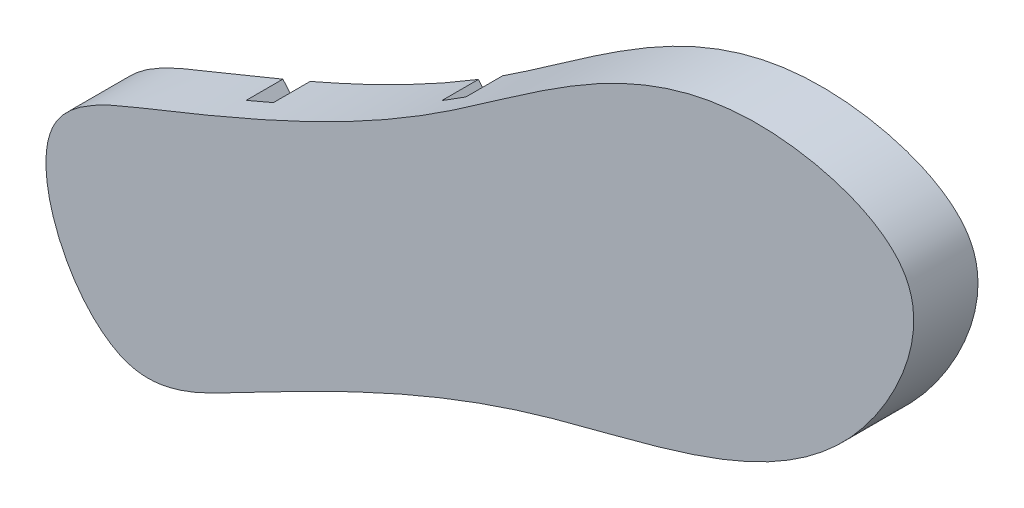
ISO-10303-21;
HEADER;
FILE_DESCRIPTION(('STEP AP214'),'2;1');
FILE_NAME('part.step','',(''),(''),'','','');
FILE_SCHEMA(('AUTOMOTIVE_DESIGN { 1 0 10303 214 1 1 1 1 }'));
ENDSEC;
DATA;
#1=APPLICATION_CONTEXT('core data for automotive mechanical design processes');
#2=APPLICATION_PROTOCOL_DEFINITION('international standard','automotive_design',2000,#1);
#3=PRODUCT_CONTEXT('',#1,'mechanical');
#4=PRODUCT('Part','Part','',(#3));
#5=PRODUCT_RELATED_PRODUCT_CATEGORY('part','',(#4));
#6=PRODUCT_DEFINITION_FORMATION('','',#4);
#7=PRODUCT_DEFINITION_CONTEXT('part definition',#1,'design');
#8=PRODUCT_DEFINITION('design','',#6,#7);
#9=PRODUCT_DEFINITION_SHAPE('','',#8);
#10=(LENGTH_UNIT() NAMED_UNIT(*) SI_UNIT(.MILLI.,.METRE.));
#11=(NAMED_UNIT(*) PLANE_ANGLE_UNIT() SI_UNIT($,.RADIAN.));
#12=(NAMED_UNIT(*) SI_UNIT($,.STERADIAN.) SOLID_ANGLE_UNIT());
#13=UNCERTAINTY_MEASURE_WITH_UNIT(LENGTH_MEASURE(1.E-05),#10,'distance_accuracy_value','');
#14=(GEOMETRIC_REPRESENTATION_CONTEXT(3) GLOBAL_UNCERTAINTY_ASSIGNED_CONTEXT((#13)) GLOBAL_UNIT_ASSIGNED_CONTEXT((#10,
#11,#12)) REPRESENTATION_CONTEXT('',''));
#15=CARTESIAN_POINT('',(0.,0.,0.));
#16=DIRECTION('',(0.,0.,1.));
#17=DIRECTION('',(1.,0.,0.));
#18=AXIS2_PLACEMENT_3D('',#15,#16,#17);
#19=CARTESIAN_POINT('',(431.734976946463,343.776693780594,16.));
#20=CARTESIAN_POINT('',(430.437738578887,340.897420233879,16.));
#21=CARTESIAN_POINT('',(434.386282354349,332.342242053711,16.));
#22=CARTESIAN_POINT('',(445.921336843738,338.542902279572,16.));
#23=CARTESIAN_POINT('',(458.123888423825,344.531424574695,16.));
#24=CARTESIAN_POINT('',(474.741212353132,346.583012603962,16.));
#25=CARTESIAN_POINT('',(480.557784038042,360.803442798524,16.));
#26=CARTESIAN_POINT('',(465.962705284653,365.603111252334,16.));
#27=CARTESIAN_POINT('',(453.620501308246,354.288763325117,16.));
#28=CARTESIAN_POINT('',(441.146604536584,348.888155611741,16.));
#29=CARTESIAN_POINT('',(432.524056239978,345.528087505037,16.));
#30=CARTESIAN_POINT('',(431.734976946463,343.776693780594,16.));
#31=B_SPLINE_CURVE_WITH_KNOTS('',3,(#19,#20,#21,#22,#23,#24,#25,#26,#27,#28,#29,#30),
.UNSPECIFIED.,.T.,.F.,(4,1,1,1,1,1,1,1,1,4),(0.,0.0878712141596317,0.141321187057833,
0.299528421597855,0.475305994888637,0.543935607079816,0.612565219270994,0.788342792561776,
0.946550027101798,1.),.UNSPECIFIED.);
#32=DIRECTION('',(0.,0.,-1.));
#33=VECTOR('',#32,1.);
#34=SURFACE_OF_LINEAR_EXTRUSION('',#31,#33);
#35=CARTESIAN_POINT('',(431.734976946463,343.776693780594,16.));
#36=VERTEX_POINT('',#35);
#37=EDGE_CURVE('E193',#36,#36,#31,.T.);
#38=ORIENTED_EDGE('',*,*,#37,.F.);
#39=EDGE_LOOP('',(#38));
#40=FACE_BOUND('',#39,.T.);
#41=DIRECTION('',(0.,0.,-1.));
#42=VECTOR('',#41,1.);
#43=CARTESIAN_POINT('',(451.438377625256,354.15385663902,16.));
#44=LINE('',#43,#42);
#45=CARTESIAN_POINT('',(451.438377626933,354.153856637072,12.5));
#46=VERTEX_POINT('',#45);
#47=CARTESIAN_POINT('',(451.438377626933,354.153856637072,14.5));
#48=VERTEX_POINT('',#47);
#49=EDGE_CURVE('E189',#46,#48,#44,.F.);
#50=ORIENTED_EDGE('',*,*,#49,.F.);
#51=CARTESIAN_POINT('',(431.734976946463,343.776693780594,12.5));
#52=CARTESIAN_POINT('',(430.437738578887,340.897420233879,12.5));
#53=CARTESIAN_POINT('',(434.386282354349,332.342242053711,12.5));
#54=CARTESIAN_POINT('',(445.921336843738,338.542902279572,12.5));
#55=CARTESIAN_POINT('',(458.123888423825,344.531424574695,12.5));
#56=CARTESIAN_POINT('',(474.741212353132,346.583012603962,12.5));
#57=CARTESIAN_POINT('',(480.557784038042,360.803442798524,12.5));
#58=CARTESIAN_POINT('',(465.962705284653,365.603111252334,12.5));
#59=CARTESIAN_POINT('',(453.620501308246,354.288763325117,12.5));
#60=CARTESIAN_POINT('',(441.146604536584,348.888155611741,12.5));
#61=CARTESIAN_POINT('',(432.524056239978,345.528087505037,12.5));
#62=CARTESIAN_POINT('',(431.734976946463,343.776693780594,12.5));
#63=B_SPLINE_CURVE_WITH_KNOTS('',3,(#51,#52,#53,#54,#55,#56,#57,#58,#59,#60,#61,#62),
.UNSPECIFIED.,.T.,.F.,(4,1,1,1,1,1,1,1,1,4),(0.,0.0878712141596317,0.141321187057833,
0.299528421597855,0.475305994888637,0.543935607079816,0.612565219270994,0.788342792561776,
0.946550027101798,1.),.UNSPECIFIED.);
#64=CARTESIAN_POINT('',(442.270356171189,349.476449601738,12.5));
#65=VERTEX_POINT('',#64);
#66=EDGE_CURVE('E208',#46,#65,#63,.T.);
#67=ORIENTED_EDGE('',*,*,#66,.T.);
#68=DIRECTION('',(0.,0.,-1.));
#69=VECTOR('',#68,1.);
#70=CARTESIAN_POINT('',(442.270356171189,349.476449601738,16.));
#71=LINE('',#70,#69);
#72=CARTESIAN_POINT('',(442.270356171189,349.476449601738,14.5));
#73=VERTEX_POINT('',#72);
#74=EDGE_CURVE('E62',#73,#65,#71,.T.);
#75=ORIENTED_EDGE('',*,*,#74,.F.);
#76=CARTESIAN_POINT('',(431.734976946463,343.776693780594,14.5));
#77=CARTESIAN_POINT('',(430.437738578887,340.897420233879,14.5));
#78=CARTESIAN_POINT('',(434.386282354349,332.342242053711,14.5));
#79=CARTESIAN_POINT('',(445.921336843738,338.542902279572,14.5));
#80=CARTESIAN_POINT('',(458.123888423825,344.531424574695,14.5));
#81=CARTESIAN_POINT('',(474.741212353132,346.583012603962,14.5));
#82=CARTESIAN_POINT('',(480.557784038042,360.803442798524,14.5));
#83=CARTESIAN_POINT('',(465.962705284653,365.603111252334,14.5));
#84=CARTESIAN_POINT('',(453.620501308246,354.288763325117,14.5));
#85=CARTESIAN_POINT('',(441.146604536584,348.888155611741,14.5));
#86=CARTESIAN_POINT('',(432.524056239978,345.528087505037,14.5));
#87=CARTESIAN_POINT('',(431.734976946463,343.776693780594,14.5));
#88=B_SPLINE_CURVE_WITH_KNOTS('',3,(#76,#77,#78,#79,#80,#81,#82,#83,#84,#85,#86,#87),
.UNSPECIFIED.,.T.,.F.,(4,1,1,1,1,1,1,1,1,4),(0.,0.0878712141596317,0.141321187057833,
0.299528421597855,0.475305994888637,0.543935607079816,0.612565219270994,0.788342792561776,
0.946550027101798,1.),.UNSPECIFIED.);
#89=CARTESIAN_POINT('',(440.786957224298,348.84158079138,14.5));
#90=VERTEX_POINT('',#89);
#91=EDGE_CURVE('E221',#90,#73,#88,.F.);
#92=ORIENTED_EDGE('',*,*,#91,.F.);
#93=DIRECTION('',(0.,0.,-1.));
#94=VECTOR('',#93,1.);
#95=CARTESIAN_POINT('',(440.786957224298,348.84158079138,16.));
#96=LINE('',#95,#94);
#97=CARTESIAN_POINT('',(440.786957224298,348.84158079138,12.5));
#98=VERTEX_POINT('',#97);
#99=EDGE_CURVE('E181',#98,#90,#96,.F.);
#100=ORIENTED_EDGE('',*,*,#99,.F.);
#101=CARTESIAN_POINT('',(448.617521684009,339.744307374951,12.5));
#102=VERTEX_POINT('',#101);
#103=EDGE_CURVE('E192',#98,#102,#63,.T.);
#104=ORIENTED_EDGE('',*,*,#103,.T.);
#105=DIRECTION('',(0.,0.,-1.));
#106=VECTOR('',#105,1.);
#107=CARTESIAN_POINT('',(448.617521684009,339.744307374952,16.));
#108=LINE('',#107,#106);
#109=CARTESIAN_POINT('',(448.617521684009,339.744307374951,14.5));
#110=VERTEX_POINT('',#109);
#111=EDGE_CURVE('E183',#110,#102,#108,.T.);
#112=ORIENTED_EDGE('',*,*,#111,.F.);
#113=CARTESIAN_POINT('',(450.072635622241,340.412036710074,14.5));
#114=VERTEX_POINT('',#113);
#115=EDGE_CURVE('E218',#114,#110,#88,.F.);
#116=ORIENTED_EDGE('',*,*,#115,.F.);
#117=DIRECTION('',(0.,0.,-1.));
#118=VECTOR('',#117,1.);
#119=CARTESIAN_POINT('',(450.07263562183,340.412036710552,16.));
#120=LINE('',#119,#118);
#121=CARTESIAN_POINT('',(450.072635622241,340.412036710074,12.5));
#122=VERTEX_POINT('',#121);
#123=EDGE_CURVE('E179',#122,#114,#120,.F.);
#124=ORIENTED_EDGE('',*,*,#123,.F.);
#125=CARTESIAN_POINT('',(460.176471985824,344.002247014242,12.5));
#126=VERTEX_POINT('',#125);
#127=EDGE_CURVE('E200',#122,#126,#63,.T.);
#128=ORIENTED_EDGE('',*,*,#127,.T.);
#129=DIRECTION('',(0.,0.,-1.));
#130=VECTOR('',#129,1.);
#131=CARTESIAN_POINT('',(460.176471982785,344.002247017773,16.));
#132=LINE('',#131,#130);
#133=CARTESIAN_POINT('',(460.176471985824,344.002247014242,14.5));
#134=VERTEX_POINT('',#133);
#135=EDGE_CURVE('E191',#134,#126,#132,.T.);
#136=ORIENTED_EDGE('',*,*,#135,.F.);
#137=CARTESIAN_POINT('',(431.734976946463,343.776693780594,14.5));
#138=CARTESIAN_POINT('',(430.437738578887,340.897420233879,14.5));
#139=CARTESIAN_POINT('',(434.386282354349,332.342242053711,14.5));
#140=CARTESIAN_POINT('',(445.921336843738,338.542902279572,14.5));
#141=CARTESIAN_POINT('',(458.123888423825,344.531424574695,14.5));
#142=CARTESIAN_POINT('',(474.741212353132,346.583012603962,14.5));
#143=CARTESIAN_POINT('',(480.557784038042,360.803442798524,14.5));
#144=CARTESIAN_POINT('',(465.962705284653,365.603111252334,14.5));
#145=CARTESIAN_POINT('',(453.620501308246,354.288763325117,14.5));
#146=CARTESIAN_POINT('',(441.146604536584,348.888155611741,14.5));
#147=CARTESIAN_POINT('',(432.524056239978,345.528087505037,14.5));
#148=CARTESIAN_POINT('',(431.734976946463,343.776693780594,14.5));
#149=B_SPLINE_CURVE_WITH_KNOTS('',3,(#137,#138,#139,#140,#141,#142,#143,#144,#145,#146,#147,
#148),.UNSPECIFIED.,.T.,.F.,(4,1,1,1,1,1,1,1,1,4),(0.,0.0878712141596317,0.141321187057833,
0.299528421597855,0.475305994888637,0.543935607079816,0.612565219270994,0.788342792561776,
0.946550027101798,1.),.UNSPECIFIED.);
#150=CARTESIAN_POINT('',(461.75435034315,344.415338982194,14.5));
#151=VERTEX_POINT('',#150);
#152=EDGE_CURVE('E41',#151,#134,#149,.F.);
#153=ORIENTED_EDGE('',*,*,#152,.F.);
#154=DIRECTION('',(0.,0.,-1.));
#155=VECTOR('',#154,1.);
#156=CARTESIAN_POINT('',(461.754350342893,344.415338982076,16.));
#157=LINE('',#156,#155);
#158=CARTESIAN_POINT('',(461.754350343149,344.415338982194,12.5));
#159=VERTEX_POINT('',#158);
#160=EDGE_CURVE('E187',#159,#151,#157,.F.);
#161=ORIENTED_EDGE('',*,*,#160,.F.);
#162=CARTESIAN_POINT('',(452.753720760194,354.983966782958,12.5));
#163=VERTEX_POINT('',#162);
#164=EDGE_CURVE('E248',#159,#163,#63,.T.);
#165=ORIENTED_EDGE('',*,*,#164,.T.);
#166=DIRECTION('',(0.,0.,-1.));
#167=VECTOR('',#166,1.);
#168=CARTESIAN_POINT('',(452.753720747704,354.983966774833,16.));
#169=LINE('',#168,#167);
#170=CARTESIAN_POINT('',(452.753720749002,354.983966773325,14.5));
#171=VERTEX_POINT('',#170);
#172=EDGE_CURVE('E185',#171,#163,#169,.T.);
#173=ORIENTED_EDGE('',*,*,#172,.F.);
#174=EDGE_CURVE('E11',#48,#171,#149,.F.);
#175=ORIENTED_EDGE('',*,*,#174,.F.);
#176=EDGE_LOOP('',(#50,#67,#75,#92,#100,#104,#112,#116,#124,#128,#136,#153,#161,#165,#173,#175));
#177=FACE_BOUND('',#176,.T.);
#178=ADVANCED_FACE('F37',(#40,#177),#34,.F.);
#179=CARTESIAN_POINT('',(477.88969650397,354.97162670106,12.5));
#180=DIRECTION('',(0.,0.,1.));
#181=DIRECTION('',(1.,0.,0.));
#182=AXIS2_PLACEMENT_3D('',#179,#180,#181);
#183=PLANE('',#182);
#184=DIRECTION('',(-0.652370099279162,0.757900556515494,0.));
#185=VECTOR('',#184,1.);
#186=CARTESIAN_POINT('',(462.291376955389,341.545225064307,12.5));
#187=LINE('',#186,#185);
#188=EDGE_CURVE('E217',#126,#46,#187,.T.);
#189=ORIENTED_EDGE('',*,*,#188,.F.);
#190=ORIENTED_EDGE('',*,*,#127,.F.);
#191=DIRECTION('',(0.652370099279164,-0.757900556515493,0.));
#192=VECTOR('',#191,1.);
#193=CARTESIAN_POINT('',(454.712485791182,335.021622543216,12.5));
#194=LINE('',#193,#192);
#195=EDGE_CURVE('E199',#65,#122,#194,.T.);
#196=ORIENTED_EDGE('',*,*,#195,.F.);
#197=ORIENTED_EDGE('',*,*,#66,.F.);
#198=EDGE_LOOP('',(#189,#190,#196,#197));
#199=FACE_BOUND('',#198,.T.);
#200=ADVANCED_FACE('F254',(#199),#183,.F.);
#201=DIRECTION('',(0.652370099279164,-0.757900556515492,0.));
#202=VECTOR('',#201,1.);
#203=CARTESIAN_POINT('',(471.266131687021,348.805391910135,12.5));
#204=LINE('',#203,#202);
#205=CARTESIAN_POINT('',(461.767479664555,359.840590583294,12.5));
#206=VERTEX_POINT('',#205);
#207=CARTESIAN_POINT('',(471.266131687021,348.805391910135,12.5));
#208=VERTEX_POINT('',#207);
#209=EDGE_CURVE('E54',#206,#208,#204,.T.);
#210=ORIENTED_EDGE('',*,*,#209,.T.);
#211=DIRECTION('',(0.907959384500458,0.419058177461734,0.));
#212=VECTOR('',#211,1.);
#213=CARTESIAN_POINT('',(472.718866702221,349.475884994074,12.5));
#214=LINE('',#213,#212);
#215=CARTESIAN_POINT('',(472.718866702221,349.475884994074,12.5));
#216=VERTEX_POINT('',#215);
#217=EDGE_CURVE('E153',#208,#216,#214,.T.);
#218=ORIENTED_EDGE('',*,*,#217,.T.);
#219=DIRECTION('',(-0.652370099279156,0.757900556515499,0.));
#220=VECTOR('',#219,1.);
#221=CARTESIAN_POINT('',(463.220214679755,360.511083667233,12.5));
#222=LINE('',#221,#220);
#223=CARTESIAN_POINT('',(463.220214679755,360.511083667233,12.5));
#224=VERTEX_POINT('',#223);
#225=EDGE_CURVE('E411',#216,#224,#222,.T.);
#226=ORIENTED_EDGE('',*,*,#225,.T.);
#227=DIRECTION('',(-0.907959384500444,-0.419058177461765,0.));
#228=VECTOR('',#227,1.);
#229=CARTESIAN_POINT('',(461.767479664555,359.840590583294,12.5));
#230=LINE('',#229,#228);
#231=EDGE_CURVE('E149',#224,#206,#230,.T.);
#232=ORIENTED_EDGE('',*,*,#231,.T.);
#233=EDGE_LOOP('',(#210,#218,#226,#232));
#234=FACE_BOUND('',#233,.T.);
#235=DIRECTION('',(-0.907959384500445,-0.419058177461762,0.));
#236=VECTOR('',#235,1.);
#237=CARTESIAN_POINT('',(479.072711041931,352.408428535478,12.5));
#238=LINE('',#237,#236);
#239=CARTESIAN_POINT('',(461.823354088216,344.447186864533,12.5));
#240=VERTEX_POINT('',#239);
#241=EDGE_CURVE('E215',#240,#159,#238,.T.);
#242=ORIENTED_EDGE('',*,*,#241,.F.);
#243=DIRECTION('',(-0.65237009927916,0.757900556515496,0.));
#244=VECTOR('',#243,1.);
#245=CARTESIAN_POINT('',(452.32470206575,355.482385537692,12.5));
#246=LINE('',#245,#244);
#247=EDGE_CURVE('E154',#240,#163,#246,.T.);
#248=ORIENTED_EDGE('',*,*,#247,.T.);
#249=ORIENTED_EDGE('',*,*,#164,.F.);
#250=EDGE_LOOP('',(#242,#248,#249));
#251=FACE_BOUND('',#250,.T.);
#252=ADVANCED_FACE('F267',(#234,#251),#183,.F.);
#253=DIRECTION('',(-0.652370099279158,0.757900556515498,0.));
#254=VECTOR('',#253,1.);
#255=CARTESIAN_POINT('',(453.54650253515,334.017991386126,12.5));
#256=LINE('',#255,#254);
#257=EDGE_CURVE('E213',#102,#98,#256,.T.);
#258=ORIENTED_EDGE('',*,*,#257,.F.);
#259=ORIENTED_EDGE('',*,*,#103,.F.);
#260=EDGE_LOOP('',(#258,#259));
#261=FACE_BOUND('',#260,.T.);
#262=ADVANCED_FACE('F264',(#261),#183,.F.);
#263=CARTESIAN_POINT('',(477.88969650397,354.97162670106,16.));
#264=DIRECTION('',(0.,0.,1.));
#265=DIRECTION('',(1.,0.,0.));
#266=AXIS2_PLACEMENT_3D('',#263,#264,#265);
#267=PLANE('',#266);
#268=ORIENTED_EDGE('',*,*,#37,.T.);
#269=EDGE_LOOP('',(#268));
#270=FACE_BOUND('',#269,.T.);
#271=ADVANCED_FACE('F266',(#270),#267,.T.);
#272=CARTESIAN_POINT('',(0.,0.,14.5));
#273=DIRECTION('',(0.,0.,-1.));
#274=DIRECTION('',(-1.,0.,0.));
#275=AXIS2_PLACEMENT_3D('',#272,#273,#274);
#276=PLANE('',#275);
#277=ORIENTED_EDGE('',*,*,#91,.T.);
#278=DIRECTION('',(-0.652370099279164,0.757900556515492,0.));
#279=VECTOR('',#278,1.);
#280=CARTESIAN_POINT('',(441.429189451744,350.453687408151,14.5));
#281=LINE('',#280,#279);
#282=EDGE_CURVE('E176',#114,#73,#281,.T.);
#283=ORIENTED_EDGE('',*,*,#282,.F.);
#284=ORIENTED_EDGE('',*,*,#115,.T.);
#285=DIRECTION('',(0.652370099279158,-0.757900556515498,0.));
#286=VECTOR('',#285,1.);
#287=CARTESIAN_POINT('',(449.47510645901,338.747995651053,14.5));
#288=LINE('',#287,#286);
#289=EDGE_CURVE('E173',#90,#110,#288,.T.);
#290=ORIENTED_EDGE('',*,*,#289,.F.);
#291=EDGE_LOOP('',(#277,#283,#284,#290));
#292=FACE_BOUND('',#291,.T.);
#293=ADVANCED_FACE('F256',(#292),#276,.T.);
#294=CARTESIAN_POINT('',(449.47510645901,338.747995651053,14.5));
#295=DIRECTION('',(0.757900556515498,0.652370099279158,0.));
#296=DIRECTION('',(-0.652370099279158,0.757900556515498,0.));
#297=AXIS2_PLACEMENT_3D('',#294,#295,#296);
#298=PLANE('',#297);
#299=ORIENTED_EDGE('',*,*,#111,.T.);
#300=ORIENTED_EDGE('',*,*,#257,.T.);
#301=ORIENTED_EDGE('',*,*,#99,.T.);
#302=ORIENTED_EDGE('',*,*,#289,.T.);
#303=EDGE_LOOP('',(#299,#300,#301,#302));
#304=FACE_BOUND('',#303,.T.);
#305=ADVANCED_FACE('F262',(#304),#298,.T.);
#306=CARTESIAN_POINT('',(441.429189451744,350.453687408151,14.5));
#307=DIRECTION('',(-0.757900556515493,-0.652370099279164,0.));
#308=DIRECTION('',(0.652370099279164,-0.757900556515492,0.));
#309=AXIS2_PLACEMENT_3D('',#306,#307,#308);
#310=PLANE('',#309);
#311=ORIENTED_EDGE('',*,*,#123,.T.);
#312=ORIENTED_EDGE('',*,*,#282,.T.);
#313=ORIENTED_EDGE('',*,*,#74,.T.);
#314=ORIENTED_EDGE('',*,*,#195,.T.);
#315=EDGE_LOOP('',(#311,#312,#313,#314));
#316=FACE_BOUND('',#315,.T.);
#317=ADVANCED_FACE('F255',(#316),#310,.T.);
#318=CARTESIAN_POINT('',(471.266131687021,348.805391910135,14.5));
#319=DIRECTION('',(0.757900556515493,0.652370099279164,0.));
#320=DIRECTION('',(-0.652370099279164,0.757900556515492,0.));
#321=AXIS2_PLACEMENT_3D('',#318,#319,#320);
#322=PLANE('',#321);
#323=ORIENTED_EDGE('',*,*,#209,.F.);
#324=DIRECTION('',(0.,0.,-1.));
#325=VECTOR('',#324,1.);
#326=CARTESIAN_POINT('',(461.767479664555,359.840590583294,14.5));
#327=LINE('',#326,#325);
#328=CARTESIAN_POINT('',(461.767479664555,359.840590583294,14.5));
#329=VERTEX_POINT('',#328);
#330=EDGE_CURVE('E148',#329,#206,#327,.T.);
#331=ORIENTED_EDGE('',*,*,#330,.F.);
#332=DIRECTION('',(0.652370099279164,-0.757900556515492,0.));
#333=VECTOR('',#332,1.);
#334=CARTESIAN_POINT('',(471.266131687021,348.805391910135,14.5));
#335=LINE('',#334,#333);
#336=CARTESIAN_POINT('',(471.266131687021,348.805391910135,14.5));
#337=VERTEX_POINT('',#336);
#338=EDGE_CURVE('E140',#329,#337,#335,.T.);
#339=ORIENTED_EDGE('',*,*,#338,.T.);
#340=DIRECTION('',(0.,0.,-1.));
#341=VECTOR('',#340,1.);
#342=CARTESIAN_POINT('',(471.266131687021,348.805391910135,14.5));
#343=LINE('',#342,#341);
#344=EDGE_CURVE('E147',#337,#208,#343,.T.);
#345=ORIENTED_EDGE('',*,*,#344,.T.);
#346=EDGE_LOOP('',(#323,#331,#339,#345));
#347=FACE_BOUND('',#346,.T.);
#348=ADVANCED_FACE('F146',(#347),#322,.T.);
#349=CARTESIAN_POINT('',(472.718866702221,349.475884994074,14.5));
#350=DIRECTION('',(-0.419058177461734,0.907959384500458,0.));
#351=DIRECTION('',(-0.907959384500458,-0.419058177461734,0.));
#352=AXIS2_PLACEMENT_3D('',#349,#350,#351);
#353=PLANE('',#352);
#354=ORIENTED_EDGE('',*,*,#217,.F.);
#355=ORIENTED_EDGE('',*,*,#344,.F.);
#356=DIRECTION('',(0.907959384500458,0.419058177461734,0.));
#357=VECTOR('',#356,1.);
#358=CARTESIAN_POINT('',(472.718866702221,349.475884994074,14.5));
#359=LINE('',#358,#357);
#360=CARTESIAN_POINT('',(472.718866702221,349.475884994074,14.5));
#361=VERTEX_POINT('',#360);
#362=EDGE_CURVE('E136',#337,#361,#359,.T.);
#363=ORIENTED_EDGE('',*,*,#362,.T.);
#364=DIRECTION('',(0.,0.,-1.));
#365=VECTOR('',#364,1.);
#366=CARTESIAN_POINT('',(472.718866702221,349.475884994074,14.5));
#367=LINE('',#366,#365);
#368=EDGE_CURVE('E155',#361,#216,#367,.T.);
#369=ORIENTED_EDGE('',*,*,#368,.T.);
#370=EDGE_LOOP('',(#354,#355,#363,#369));
#371=FACE_BOUND('',#370,.T.);
#372=ADVANCED_FACE('F151',(#371),#353,.T.);
#373=CARTESIAN_POINT('',(463.220214679755,360.511083667233,14.5));
#374=DIRECTION('',(-0.757900556515499,-0.652370099279156,0.));
#375=DIRECTION('',(0.652370099279156,-0.757900556515499,0.));
#376=AXIS2_PLACEMENT_3D('',#373,#374,#375);
#377=PLANE('',#376);
#378=ORIENTED_EDGE('',*,*,#225,.F.);
#379=ORIENTED_EDGE('',*,*,#368,.F.);
#380=DIRECTION('',(-0.652370099279156,0.757900556515499,0.));
#381=VECTOR('',#380,1.);
#382=CARTESIAN_POINT('',(463.220214679755,360.511083667233,14.5));
#383=LINE('',#382,#381);
#384=CARTESIAN_POINT('',(463.220214679755,360.511083667233,14.5));
#385=VERTEX_POINT('',#384);
#386=EDGE_CURVE('E141',#361,#385,#383,.T.);
#387=ORIENTED_EDGE('',*,*,#386,.T.);
#388=DIRECTION('',(0.,0.,-1.));
#389=VECTOR('',#388,1.);
#390=CARTESIAN_POINT('',(463.220214679755,360.511083667233,14.5));
#391=LINE('',#390,#389);
#392=EDGE_CURVE('E160',#385,#224,#391,.T.);
#393=ORIENTED_EDGE('',*,*,#392,.T.);
#394=EDGE_LOOP('',(#378,#379,#387,#393));
#395=FACE_BOUND('',#394,.T.);
#396=ADVANCED_FACE('F336',(#395),#377,.T.);
#397=CARTESIAN_POINT('',(461.767479664555,359.840590583294,14.5));
#398=DIRECTION('',(0.419058177461765,-0.907959384500444,0.));
#399=DIRECTION('',(0.907959384500444,0.419058177461765,0.));
#400=AXIS2_PLACEMENT_3D('',#397,#398,#399);
#401=PLANE('',#400);
#402=ORIENTED_EDGE('',*,*,#231,.F.);
#403=ORIENTED_EDGE('',*,*,#392,.F.);
#404=DIRECTION('',(-0.907959384500444,-0.419058177461765,0.));
#405=VECTOR('',#404,1.);
#406=CARTESIAN_POINT('',(461.767479664555,359.840590583294,14.5));
#407=LINE('',#406,#405);
#408=EDGE_CURVE('E418',#385,#329,#407,.T.);
#409=ORIENTED_EDGE('',*,*,#408,.T.);
#410=ORIENTED_EDGE('',*,*,#330,.T.);
#411=EDGE_LOOP('',(#402,#403,#409,#410));
#412=FACE_BOUND('',#411,.T.);
#413=ADVANCED_FACE('F345',(#412),#401,.T.);
#414=CARTESIAN_POINT('',(0.,0.,14.5));
#415=DIRECTION('',(0.,0.,-1.));
#416=DIRECTION('',(-1.,0.,0.));
#417=AXIS2_PLACEMENT_3D('',#414,#415,#416);
#418=PLANE('',#417);
#419=ORIENTED_EDGE('',*,*,#338,.F.);
#420=ORIENTED_EDGE('',*,*,#408,.F.);
#421=ORIENTED_EDGE('',*,*,#386,.F.);
#422=ORIENTED_EDGE('',*,*,#362,.F.);
#423=EDGE_LOOP('',(#419,#420,#421,#422));
#424=FACE_BOUND('',#423,.T.);
#425=ADVANCED_FACE('F138',(#424),#418,.T.);
#426=CARTESIAN_POINT('',(0.,0.,14.5));
#427=DIRECTION('',(0.,0.,-1.));
#428=DIRECTION('',(-1.,0.,0.));
#429=AXIS2_PLACEMENT_3D('',#426,#427,#428);
#430=PLANE('',#429);
#431=ORIENTED_EDGE('',*,*,#174,.T.);
#432=DIRECTION('',(-0.65237009927916,0.757900556515496,0.));
#433=VECTOR('',#432,1.);
#434=CARTESIAN_POINT('',(452.32470206575,355.482385537692,14.5));
#435=LINE('',#434,#433);
#436=CARTESIAN_POINT('',(461.823354088216,344.447186864533,14.5));
#437=VERTEX_POINT('',#436);
#438=EDGE_CURVE('E168',#437,#171,#435,.T.);
#439=ORIENTED_EDGE('',*,*,#438,.F.);
#440=DIRECTION('',(0.907959384500445,0.419058177461762,0.));
#441=VECTOR('',#440,1.);
#442=CARTESIAN_POINT('',(461.823354088216,344.447186864533,14.5));
#443=LINE('',#442,#441);
#444=EDGE_CURVE('E166',#151,#437,#443,.T.);
#445=ORIENTED_EDGE('',*,*,#444,.F.);
#446=ORIENTED_EDGE('',*,*,#152,.T.);
#447=DIRECTION('',(0.652370099279162,-0.757900556515494,0.));
#448=VECTOR('',#447,1.);
#449=CARTESIAN_POINT('',(460.370619073015,343.776693780594,14.5));
#450=LINE('',#449,#448);
#451=EDGE_CURVE('E158',#48,#134,#450,.T.);
#452=ORIENTED_EDGE('',*,*,#451,.F.);
#453=EDGE_LOOP('',(#431,#439,#445,#446,#452));
#454=FACE_BOUND('',#453,.T.);
#455=ADVANCED_FACE('F234',(#454),#430,.T.);
#456=CARTESIAN_POINT('',(460.370619073015,343.776693780594,14.5));
#457=DIRECTION('',(0.757900556515494,0.652370099279162,0.));
#458=DIRECTION('',(-0.652370099279162,0.757900556515494,0.));
#459=AXIS2_PLACEMENT_3D('',#456,#457,#458);
#460=PLANE('',#459);
#461=ORIENTED_EDGE('',*,*,#135,.T.);
#462=ORIENTED_EDGE('',*,*,#188,.T.);
#463=ORIENTED_EDGE('',*,*,#49,.T.);
#464=ORIENTED_EDGE('',*,*,#451,.T.);
#465=EDGE_LOOP('',(#461,#462,#463,#464));
#466=FACE_BOUND('',#465,.T.);
#467=ADVANCED_FACE('F241',(#466),#460,.T.);
#468=CARTESIAN_POINT('',(461.823354088216,344.447186864533,14.5));
#469=DIRECTION('',(-0.419058177461762,0.907959384500445,0.));
#470=DIRECTION('',(-0.907959384500445,-0.419058177461762,0.));
#471=AXIS2_PLACEMENT_3D('',#468,#469,#470);
#472=PLANE('',#471);
#473=ORIENTED_EDGE('',*,*,#160,.T.);
#474=ORIENTED_EDGE('',*,*,#444,.T.);
#475=DIRECTION('',(0.,0.,-1.));
#476=VECTOR('',#475,1.);
#477=CARTESIAN_POINT('',(461.823354088216,344.447186864533,14.5));
#478=LINE('',#477,#476);
#479=EDGE_CURVE('E170',#437,#240,#478,.T.);
#480=ORIENTED_EDGE('',*,*,#479,.T.);
#481=ORIENTED_EDGE('',*,*,#241,.T.);
#482=EDGE_LOOP('',(#473,#474,#480,#481));
#483=FACE_BOUND('',#482,.T.);
#484=ADVANCED_FACE('F380',(#483),#472,.T.);
#485=CARTESIAN_POINT('',(452.32470206575,355.482385537692,14.5));
#486=DIRECTION('',(-0.757900556515496,-0.65237009927916,0.));
#487=DIRECTION('',(0.65237009927916,-0.757900556515496,0.));
#488=AXIS2_PLACEMENT_3D('',#485,#486,#487);
#489=PLANE('',#488);
#490=ORIENTED_EDGE('',*,*,#172,.T.);
#491=ORIENTED_EDGE('',*,*,#247,.F.);
#492=ORIENTED_EDGE('',*,*,#479,.F.);
#493=ORIENTED_EDGE('',*,*,#438,.T.);
#494=EDGE_LOOP('',(#490,#491,#492,#493));
#495=FACE_BOUND('',#494,.T.);
#496=ADVANCED_FACE('F389',(#495),#489,.T.);
#497=CLOSED_SHELL('',(#178,#200,#252,#262,#271,#293,#305,#317,#348,#372,#396,#413,#425,#455,
#467,#484,#496));
#498=MANIFOLD_SOLID_BREP('B2',#497);
#499=ADVANCED_BREP_SHAPE_REPRESENTATION('',(#18,#498),#14);
#500=SHAPE_DEFINITION_REPRESENTATION(#9,#499);
ENDSEC;
END-ISO-10303-21;
